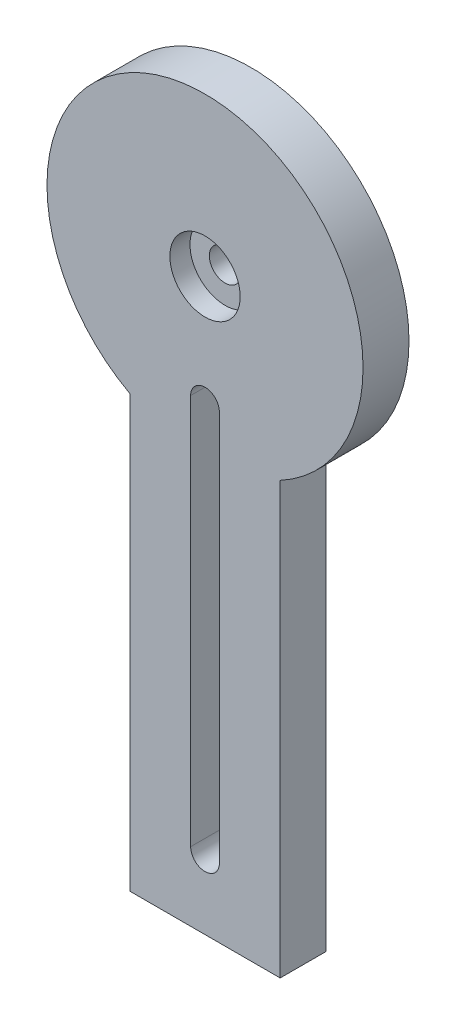
ISO-10303-21;
HEADER;
FILE_DESCRIPTION(('STEP AP214'),'2;1');
FILE_NAME('part.step','',(''),(''),'','','');
FILE_SCHEMA(('AUTOMOTIVE_DESIGN { 1 0 10303 214 1 1 1 1 }'));
ENDSEC;
DATA;
#1=APPLICATION_CONTEXT('core data for automotive mechanical design processes');
#2=APPLICATION_PROTOCOL_DEFINITION('international standard','automotive_design',2000,#1);
#3=PRODUCT_CONTEXT('',#1,'mechanical');
#4=PRODUCT('Part','Part','',(#3));
#5=PRODUCT_RELATED_PRODUCT_CATEGORY('part','',(#4));
#6=PRODUCT_DEFINITION_FORMATION('','',#4);
#7=PRODUCT_DEFINITION_CONTEXT('part definition',#1,'design');
#8=PRODUCT_DEFINITION('design','',#6,#7);
#9=PRODUCT_DEFINITION_SHAPE('','',#8);
#10=(LENGTH_UNIT() NAMED_UNIT(*) SI_UNIT(.MILLI.,.METRE.));
#11=(NAMED_UNIT(*) PLANE_ANGLE_UNIT() SI_UNIT($,.RADIAN.));
#12=(NAMED_UNIT(*) SI_UNIT($,.STERADIAN.) SOLID_ANGLE_UNIT());
#13=UNCERTAINTY_MEASURE_WITH_UNIT(LENGTH_MEASURE(1.E-05),#10,'distance_accuracy_value','');
#14=(GEOMETRIC_REPRESENTATION_CONTEXT(3) GLOBAL_UNCERTAINTY_ASSIGNED_CONTEXT((#13)) GLOBAL_UNIT_ASSIGNED_CONTEXT((#10,
#11,#12)) REPRESENTATION_CONTEXT('',''));
#15=CARTESIAN_POINT('',(0.,0.,0.));
#16=DIRECTION('',(0.,0.,1.));
#17=DIRECTION('',(1.,0.,0.));
#18=AXIS2_PLACEMENT_3D('',#15,#16,#17);
#19=CARTESIAN_POINT('',(0.,0.,4.));
#20=DIRECTION('',(0.,1.,0.));
#21=DIRECTION('',(0.,0.,1.));
#22=AXIS2_PLACEMENT_3D('',#19,#20,#21);
#23=PLANE('',#22);
#24=DIRECTION('',(1.,0.,0.));
#25=VECTOR('',#24,1.);
#26=CARTESIAN_POINT('',(0.,0.,-4.));
#27=LINE('',#26,#25);
#28=CARTESIAN_POINT('',(0.,0.,-4.));
#29=VERTEX_POINT('',#28);
#30=CARTESIAN_POINT('',(26.16,0.,-4.));
#31=VERTEX_POINT('',#30);
#32=EDGE_CURVE('E134',#29,#31,#27,.T.);
#33=ORIENTED_EDGE('',*,*,#32,.T.);
#34=DIRECTION('',(0.,0.,-1.));
#35=VECTOR('',#34,1.);
#36=CARTESIAN_POINT('',(26.16,0.,4.));
#37=LINE('',#36,#35);
#38=CARTESIAN_POINT('',(26.16,0.,4.));
#39=VERTEX_POINT('',#38);
#40=EDGE_CURVE('E11',#39,#31,#37,.T.);
#41=ORIENTED_EDGE('',*,*,#40,.F.);
#42=DIRECTION('',(1.,0.,0.));
#43=VECTOR('',#42,1.);
#44=CARTESIAN_POINT('',(0.,0.,4.));
#45=LINE('',#44,#43);
#46=CARTESIAN_POINT('',(0.,0.,4.));
#47=VERTEX_POINT('',#46);
#48=EDGE_CURVE('E138',#47,#39,#45,.T.);
#49=ORIENTED_EDGE('',*,*,#48,.F.);
#50=DIRECTION('',(0.,0.,-1.));
#51=VECTOR('',#50,1.);
#52=CARTESIAN_POINT('',(0.,0.,4.));
#53=LINE('',#52,#51);
#54=EDGE_CURVE('E148',#47,#29,#53,.T.);
#55=ORIENTED_EDGE('',*,*,#54,.T.);
#56=EDGE_LOOP('',(#33,#41,#49,#55));
#57=FACE_BOUND('',#56,.T.);
#58=ADVANCED_FACE('F34',(#57),#23,.F.);
#59=CARTESIAN_POINT('',(26.16,0.,4.));
#60=DIRECTION('',(-1.,0.,0.));
#61=DIRECTION('',(0.,0.,1.));
#62=AXIS2_PLACEMENT_3D('',#59,#60,#61);
#63=PLANE('',#62);
#64=DIRECTION('',(0.,1.,0.));
#65=VECTOR('',#64,1.);
#66=CARTESIAN_POINT('',(26.16,0.,-4.));
#67=LINE('',#66,#65);
#68=CARTESIAN_POINT('',(26.16,75.,-4.));
#69=VERTEX_POINT('',#68);
#70=EDGE_CURVE('E151',#31,#69,#67,.T.);
#71=ORIENTED_EDGE('',*,*,#70,.T.);
#72=DIRECTION('',(0.,0.,-1.));
#73=VECTOR('',#72,1.);
#74=CARTESIAN_POINT('',(26.16,75.,4.));
#75=LINE('',#74,#73);
#76=CARTESIAN_POINT('',(26.16,75.,4.));
#77=VERTEX_POINT('',#76);
#78=EDGE_CURVE('E41',#77,#69,#75,.T.);
#79=ORIENTED_EDGE('',*,*,#78,.F.);
#80=DIRECTION('',(0.,1.,0.));
#81=VECTOR('',#80,1.);
#82=CARTESIAN_POINT('',(26.16,0.,4.));
#83=LINE('',#82,#81);
#84=EDGE_CURVE('E141',#39,#77,#83,.T.);
#85=ORIENTED_EDGE('',*,*,#84,.F.);
#86=ORIENTED_EDGE('',*,*,#40,.T.);
#87=EDGE_LOOP('',(#71,#79,#85,#86));
#88=FACE_BOUND('',#87,.T.);
#89=ADVANCED_FACE('F179',(#88),#63,.F.);
#90=CARTESIAN_POINT('',(13.08,99.1901550222399,4.));
#91=DIRECTION('',(0.,0.,-1.));
#92=DIRECTION('',(-1.,0.,0.));
#93=AXIS2_PLACEMENT_3D('',#90,#91,#92);
#94=CYLINDRICAL_SURFACE('',#93,27.5);
#95=CARTESIAN_POINT('',(13.08,99.1901550222399,-4.));
#96=DIRECTION('',(0.,0.,1.));
#97=DIRECTION('',(1.,0.,0.));
#98=AXIS2_PLACEMENT_3D('',#95,#96,#97);
#99=CIRCLE('',#98,27.5);
#100=CARTESIAN_POINT('',(0.,75.,-4.));
#101=VERTEX_POINT('',#100);
#102=EDGE_CURVE('E153',#69,#101,#99,.T.);
#103=ORIENTED_EDGE('',*,*,#102,.T.);
#104=DIRECTION('',(0.,0.,-1.));
#105=VECTOR('',#104,1.);
#106=CARTESIAN_POINT('',(0.,75.,4.));
#107=LINE('',#106,#105);
#108=CARTESIAN_POINT('',(0.,75.,4.));
#109=VERTEX_POINT('',#108);
#110=EDGE_CURVE('E158',#109,#101,#107,.T.);
#111=ORIENTED_EDGE('',*,*,#110,.F.);
#112=CARTESIAN_POINT('',(13.08,99.1901550222399,4.));
#113=DIRECTION('',(0.,0.,1.));
#114=DIRECTION('',(1.,0.,0.));
#115=AXIS2_PLACEMENT_3D('',#112,#113,#114);
#116=CIRCLE('',#115,27.5);
#117=EDGE_CURVE('E144',#77,#109,#116,.T.);
#118=ORIENTED_EDGE('',*,*,#117,.F.);
#119=ORIENTED_EDGE('',*,*,#78,.T.);
#120=EDGE_LOOP('',(#103,#111,#118,#119));
#121=FACE_BOUND('',#120,.T.);
#122=ADVANCED_FACE('F165',(#121),#94,.T.);
#123=CARTESIAN_POINT('',(0.,0.,4.));
#124=DIRECTION('',(1.,0.,0.));
#125=DIRECTION('',(0.,0.,-1.));
#126=AXIS2_PLACEMENT_3D('',#123,#124,#125);
#127=PLANE('',#126);
#128=DIRECTION('',(0.,-1.,0.));
#129=VECTOR('',#128,1.);
#130=CARTESIAN_POINT('',(0.,0.,-4.));
#131=LINE('',#130,#129);
#132=EDGE_CURVE('E142',#101,#29,#131,.T.);
#133=ORIENTED_EDGE('',*,*,#132,.T.);
#134=ORIENTED_EDGE('',*,*,#54,.F.);
#135=DIRECTION('',(0.,-1.,0.));
#136=VECTOR('',#135,1.);
#137=CARTESIAN_POINT('',(0.,0.,4.));
#138=LINE('',#137,#136);
#139=EDGE_CURVE('E146',#109,#47,#138,.T.);
#140=ORIENTED_EDGE('',*,*,#139,.F.);
#141=ORIENTED_EDGE('',*,*,#110,.T.);
#142=EDGE_LOOP('',(#133,#134,#140,#141));
#143=FACE_BOUND('',#142,.T.);
#144=ADVANCED_FACE('F172',(#143),#127,.F.);
#145=CARTESIAN_POINT('',(13.08,99.1901550222399,4.));
#146=DIRECTION('',(0.,0.,1.));
#147=DIRECTION('',(1.,0.,0.));
#148=AXIS2_PLACEMENT_3D('',#145,#146,#147);
#149=PLANE('',#148);
#150=CARTESIAN_POINT('',(13.08,99.1901550222399,4.));
#151=DIRECTION('',(0.,0.,1.));
#152=DIRECTION('',(1.,0.,0.));
#153=AXIS2_PLACEMENT_3D('',#150,#151,#152);
#154=CIRCLE('',#153,6.119);
#155=CARTESIAN_POINT('',(19.199,99.1901550222399,4.));
#156=VERTEX_POINT('',#155);
#157=EDGE_CURVE('E225',#156,#156,#154,.T.);
#158=ORIENTED_EDGE('',*,*,#157,.F.);
#159=EDGE_LOOP('',(#158));
#160=FACE_BOUND('',#159,.T.);
#161=CARTESIAN_POINT('',(13.08,12.,4.));
#162=DIRECTION('',(0.,0.,1.));
#163=DIRECTION('',(1.,0.,0.));
#164=AXIS2_PLACEMENT_3D('',#161,#162,#163);
#165=CIRCLE('',#164,2.5);
#166=CARTESIAN_POINT('',(10.58,12.,4.));
#167=VERTEX_POINT('',#166);
#168=CARTESIAN_POINT('',(15.58,12.,4.));
#169=VERTEX_POINT('',#168);
#170=EDGE_CURVE('E48',#167,#169,#165,.T.);
#171=ORIENTED_EDGE('',*,*,#170,.F.);
#172=DIRECTION('',(0.,-1.,0.));
#173=VECTOR('',#172,1.);
#174=CARTESIAN_POINT('',(10.58,12.,4.));
#175=LINE('',#174,#173);
#176=CARTESIAN_POINT('',(10.58,80.,4.));
#177=VERTEX_POINT('',#176);
#178=EDGE_CURVE('E116',#177,#167,#175,.T.);
#179=ORIENTED_EDGE('',*,*,#178,.F.);
#180=CARTESIAN_POINT('',(13.08,80.,4.));
#181=DIRECTION('',(0.,0.,1.));
#182=DIRECTION('',(1.,0.,0.));
#183=AXIS2_PLACEMENT_3D('',#180,#181,#182);
#184=CIRCLE('',#183,2.5);
#185=CARTESIAN_POINT('',(15.58,80.,4.));
#186=VERTEX_POINT('',#185);
#187=EDGE_CURVE('E119',#186,#177,#184,.T.);
#188=ORIENTED_EDGE('',*,*,#187,.F.);
#189=DIRECTION('',(0.,1.,0.));
#190=VECTOR('',#189,1.);
#191=CARTESIAN_POINT('',(15.58,12.,4.));
#192=LINE('',#191,#190);
#193=EDGE_CURVE('E128',#169,#186,#192,.T.);
#194=ORIENTED_EDGE('',*,*,#193,.F.);
#195=EDGE_LOOP('',(#171,#179,#188,#194));
#196=FACE_BOUND('',#195,.T.);
#197=ORIENTED_EDGE('',*,*,#48,.T.);
#198=ORIENTED_EDGE('',*,*,#84,.T.);
#199=ORIENTED_EDGE('',*,*,#117,.T.);
#200=ORIENTED_EDGE('',*,*,#139,.T.);
#201=EDGE_LOOP('',(#197,#198,#199,#200));
#202=FACE_BOUND('',#201,.T.);
#203=ADVANCED_FACE('F178',(#160,#196,#202),#149,.T.);
#204=CARTESIAN_POINT('',(13.08,99.1901550222399,-4.));
#205=DIRECTION('',(0.,0.,1.));
#206=DIRECTION('',(1.,0.,0.));
#207=AXIS2_PLACEMENT_3D('',#204,#205,#206);
#208=PLANE('',#207);
#209=CARTESIAN_POINT('',(13.08,99.1901550222399,-4.));
#210=DIRECTION('',(0.,0.,1.));
#211=DIRECTION('',(1.,0.,0.));
#212=AXIS2_PLACEMENT_3D('',#209,#210,#211);
#213=CIRCLE('',#212,2.75);
#214=CARTESIAN_POINT('',(15.83,99.1901550222399,-4.));
#215=VERTEX_POINT('',#214);
#216=EDGE_CURVE('E122',#215,#215,#213,.T.);
#217=ORIENTED_EDGE('',*,*,#216,.T.);
#218=EDGE_LOOP('',(#217));
#219=FACE_BOUND('',#218,.T.);
#220=DIRECTION('',(0.,-1.,0.));
#221=VECTOR('',#220,1.);
#222=CARTESIAN_POINT('',(10.58,12.,-4.));
#223=LINE('',#222,#221);
#224=CARTESIAN_POINT('',(10.58,80.,-4.));
#225=VERTEX_POINT('',#224);
#226=CARTESIAN_POINT('',(10.58,12.,-4.));
#227=VERTEX_POINT('',#226);
#228=EDGE_CURVE('E106',#225,#227,#223,.T.);
#229=ORIENTED_EDGE('',*,*,#228,.T.);
#230=CARTESIAN_POINT('',(13.08,12.,-4.));
#231=DIRECTION('',(0.,0.,1.));
#232=DIRECTION('',(1.,0.,0.));
#233=AXIS2_PLACEMENT_3D('',#230,#231,#232);
#234=CIRCLE('',#233,2.5);
#235=CARTESIAN_POINT('',(15.58,12.,-4.));
#236=VERTEX_POINT('',#235);
#237=EDGE_CURVE('E100',#227,#236,#234,.T.);
#238=ORIENTED_EDGE('',*,*,#237,.T.);
#239=DIRECTION('',(0.,1.,0.));
#240=VECTOR('',#239,1.);
#241=CARTESIAN_POINT('',(15.58,12.,-4.));
#242=LINE('',#241,#240);
#243=CARTESIAN_POINT('',(15.58,80.,-4.));
#244=VERTEX_POINT('',#243);
#245=EDGE_CURVE('E109',#236,#244,#242,.T.);
#246=ORIENTED_EDGE('',*,*,#245,.T.);
#247=CARTESIAN_POINT('',(13.08,80.,-4.));
#248=DIRECTION('',(0.,0.,1.));
#249=DIRECTION('',(1.,0.,0.));
#250=AXIS2_PLACEMENT_3D('',#247,#248,#249);
#251=CIRCLE('',#250,2.5);
#252=EDGE_CURVE('E56',#244,#225,#251,.T.);
#253=ORIENTED_EDGE('',*,*,#252,.T.);
#254=EDGE_LOOP('',(#229,#238,#246,#253));
#255=FACE_BOUND('',#254,.T.);
#256=ORIENTED_EDGE('',*,*,#32,.F.);
#257=ORIENTED_EDGE('',*,*,#132,.F.);
#258=ORIENTED_EDGE('',*,*,#102,.F.);
#259=ORIENTED_EDGE('',*,*,#70,.F.);
#260=EDGE_LOOP('',(#256,#257,#258,#259));
#261=FACE_BOUND('',#260,.T.);
#262=ADVANCED_FACE('F113',(#219,#255,#261),#208,.F.);
#263=CARTESIAN_POINT('',(13.08,12.,-4.));
#264=DIRECTION('',(0.,0.,1.));
#265=DIRECTION('',(1.,0.,0.));
#266=AXIS2_PLACEMENT_3D('',#263,#264,#265);
#267=CYLINDRICAL_SURFACE('',#266,2.5);
#268=ORIENTED_EDGE('',*,*,#170,.T.);
#269=DIRECTION('',(0.,0.,1.));
#270=VECTOR('',#269,1.);
#271=CARTESIAN_POINT('',(15.58,12.,-4.));
#272=LINE('',#271,#270);
#273=EDGE_CURVE('E96',#236,#169,#272,.T.);
#274=ORIENTED_EDGE('',*,*,#273,.F.);
#275=ORIENTED_EDGE('',*,*,#237,.F.);
#276=DIRECTION('',(0.,0.,1.));
#277=VECTOR('',#276,1.);
#278=CARTESIAN_POINT('',(10.58,12.,-4.));
#279=LINE('',#278,#277);
#280=EDGE_CURVE('E132',#227,#167,#279,.T.);
#281=ORIENTED_EDGE('',*,*,#280,.T.);
#282=EDGE_LOOP('',(#268,#274,#275,#281));
#283=FACE_BOUND('',#282,.T.);
#284=ADVANCED_FACE('F98',(#283),#267,.F.);
#285=CARTESIAN_POINT('',(10.58,12.,-4.));
#286=DIRECTION('',(-1.,0.,0.));
#287=DIRECTION('',(0.,0.,1.));
#288=AXIS2_PLACEMENT_3D('',#285,#286,#287);
#289=PLANE('',#288);
#290=ORIENTED_EDGE('',*,*,#178,.T.);
#291=ORIENTED_EDGE('',*,*,#280,.F.);
#292=ORIENTED_EDGE('',*,*,#228,.F.);
#293=DIRECTION('',(0.,0.,1.));
#294=VECTOR('',#293,1.);
#295=CARTESIAN_POINT('',(10.58,80.,-4.));
#296=LINE('',#295,#294);
#297=EDGE_CURVE('E135',#225,#177,#296,.T.);
#298=ORIENTED_EDGE('',*,*,#297,.T.);
#299=EDGE_LOOP('',(#290,#291,#292,#298));
#300=FACE_BOUND('',#299,.T.);
#301=ADVANCED_FACE('F197',(#300),#289,.F.);
#302=CARTESIAN_POINT('',(13.08,80.,-4.));
#303=DIRECTION('',(0.,0.,1.));
#304=DIRECTION('',(1.,0.,0.));
#305=AXIS2_PLACEMENT_3D('',#302,#303,#304);
#306=CYLINDRICAL_SURFACE('',#305,2.5);
#307=ORIENTED_EDGE('',*,*,#187,.T.);
#308=ORIENTED_EDGE('',*,*,#297,.F.);
#309=ORIENTED_EDGE('',*,*,#252,.F.);
#310=DIRECTION('',(0.,0.,1.));
#311=VECTOR('',#310,1.);
#312=CARTESIAN_POINT('',(15.58,80.,-4.));
#313=LINE('',#312,#311);
#314=EDGE_CURVE('E105',#244,#186,#313,.T.);
#315=ORIENTED_EDGE('',*,*,#314,.T.);
#316=EDGE_LOOP('',(#307,#308,#309,#315));
#317=FACE_BOUND('',#316,.T.);
#318=ADVANCED_FACE('F201',(#317),#306,.F.);
#319=CARTESIAN_POINT('',(15.58,12.,-4.));
#320=DIRECTION('',(1.,0.,0.));
#321=DIRECTION('',(0.,0.,-1.));
#322=AXIS2_PLACEMENT_3D('',#319,#320,#321);
#323=PLANE('',#322);
#324=ORIENTED_EDGE('',*,*,#193,.T.);
#325=ORIENTED_EDGE('',*,*,#314,.F.);
#326=ORIENTED_EDGE('',*,*,#245,.F.);
#327=ORIENTED_EDGE('',*,*,#273,.T.);
#328=EDGE_LOOP('',(#324,#325,#326,#327));
#329=FACE_BOUND('',#328,.T.);
#330=ADVANCED_FACE('F110',(#329),#323,.F.);
#331=CARTESIAN_POINT('',(13.08,99.1901550222399,4.));
#332=DIRECTION('',(0.,0.,1.));
#333=DIRECTION('',(1.,0.,0.));
#334=AXIS2_PLACEMENT_3D('',#331,#332,#333);
#335=CYLINDRICAL_SURFACE('',#334,2.75);
#336=ORIENTED_EDGE('',*,*,#216,.F.);
#337=EDGE_LOOP('',(#336));
#338=FACE_BOUND('',#337,.T.);
#339=CARTESIAN_POINT('',(13.08,99.1901550222399,0.5));
#340=DIRECTION('',(0.,0.,1.));
#341=DIRECTION('',(1.,0.,0.));
#342=AXIS2_PLACEMENT_3D('',#339,#340,#341);
#343=CIRCLE('',#342,2.75);
#344=CARTESIAN_POINT('',(15.83,99.1901550222399,0.5));
#345=VERTEX_POINT('',#344);
#346=EDGE_CURVE('E227',#345,#345,#343,.T.);
#347=ORIENTED_EDGE('',*,*,#346,.T.);
#348=EDGE_LOOP('',(#347));
#349=FACE_BOUND('',#348,.T.);
#350=ADVANCED_FACE('F200',(#338,#349),#335,.F.);
#351=CARTESIAN_POINT('',(15.83,99.1901550222399,0.5));
#352=DIRECTION('',(0.,0.,-1.));
#353=DIRECTION('',(-1.,0.,0.));
#354=AXIS2_PLACEMENT_3D('',#351,#352,#353);
#355=PLANE('',#354);
#356=ORIENTED_EDGE('',*,*,#346,.F.);
#357=EDGE_LOOP('',(#356));
#358=FACE_BOUND('',#357,.T.);
#359=CARTESIAN_POINT('',(13.08,99.1901550222399,0.5));
#360=DIRECTION('',(0.,0.,1.));
#361=DIRECTION('',(1.,0.,0.));
#362=AXIS2_PLACEMENT_3D('',#359,#360,#361);
#363=CIRCLE('',#362,6.119);
#364=CARTESIAN_POINT('',(19.199,99.1901550222399,0.5));
#365=VERTEX_POINT('',#364);
#366=EDGE_CURVE('E222',#365,#365,#363,.T.);
#367=ORIENTED_EDGE('',*,*,#366,.T.);
#368=EDGE_LOOP('',(#367));
#369=FACE_BOUND('',#368,.T.);
#370=ADVANCED_FACE('F209',(#358,#369),#355,.F.);
#371=CARTESIAN_POINT('',(13.08,99.1901550222399,4.));
#372=DIRECTION('',(0.,0.,1.));
#373=DIRECTION('',(1.,0.,0.));
#374=AXIS2_PLACEMENT_3D('',#371,#372,#373);
#375=CYLINDRICAL_SURFACE('',#374,6.119);
#376=ORIENTED_EDGE('',*,*,#366,.F.);
#377=EDGE_LOOP('',(#376));
#378=FACE_BOUND('',#377,.T.);
#379=ORIENTED_EDGE('',*,*,#157,.T.);
#380=EDGE_LOOP('',(#379));
#381=FACE_BOUND('',#380,.T.);
#382=ADVANCED_FACE('F213',(#378,#381),#375,.F.);
#383=CLOSED_SHELL('',(#58,#89,#122,#144,#203,#262,#284,#301,#318,#330,#350,#370,#382));
#384=MANIFOLD_SOLID_BREP('B2',#383);
#385=ADVANCED_BREP_SHAPE_REPRESENTATION('',(#18,#384),#14);
#386=SHAPE_DEFINITION_REPRESENTATION(#9,#385);
ENDSEC;
END-ISO-10303-21;
